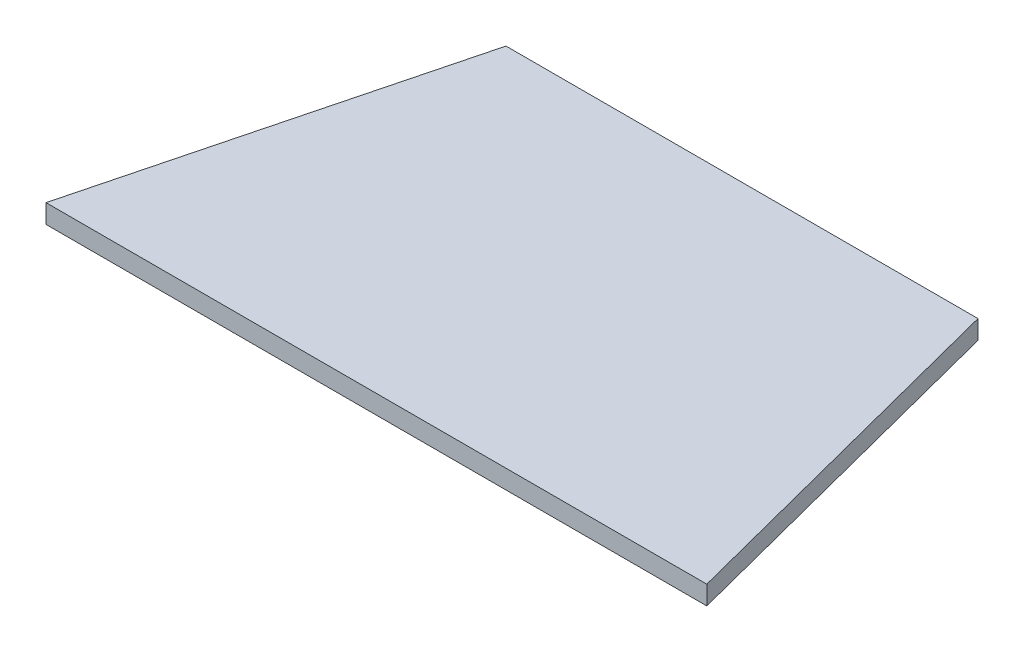
ISO-10303-21;
HEADER;
FILE_DESCRIPTION(('STEP AP214'),'2;1');
FILE_NAME('part.step','',(''),(''),'','','');
FILE_SCHEMA(('AUTOMOTIVE_DESIGN { 1 0 10303 214 1 1 1 1 }'));
ENDSEC;
DATA;
#1=APPLICATION_CONTEXT('core data for automotive mechanical design processes');
#2=APPLICATION_PROTOCOL_DEFINITION('international standard','automotive_design',2000,#1);
#3=PRODUCT_CONTEXT('',#1,'mechanical');
#4=PRODUCT('Part','Part','',(#3));
#5=PRODUCT_RELATED_PRODUCT_CATEGORY('part','',(#4));
#6=PRODUCT_DEFINITION_FORMATION('','',#4);
#7=PRODUCT_DEFINITION_CONTEXT('part definition',#1,'design');
#8=PRODUCT_DEFINITION('design','',#6,#7);
#9=PRODUCT_DEFINITION_SHAPE('','',#8);
#10=(LENGTH_UNIT() NAMED_UNIT(*) SI_UNIT(.MILLI.,.METRE.));
#11=(NAMED_UNIT(*) PLANE_ANGLE_UNIT() SI_UNIT($,.RADIAN.));
#12=(NAMED_UNIT(*) SI_UNIT($,.STERADIAN.) SOLID_ANGLE_UNIT());
#13=UNCERTAINTY_MEASURE_WITH_UNIT(LENGTH_MEASURE(1.E-05),#10,'distance_accuracy_value','');
#14=(GEOMETRIC_REPRESENTATION_CONTEXT(3) GLOBAL_UNCERTAINTY_ASSIGNED_CONTEXT((#13)) GLOBAL_UNIT_ASSIGNED_CONTEXT((#10,
#11,#12)) REPRESENTATION_CONTEXT('',''));
#15=CARTESIAN_POINT('',(0.,0.,0.));
#16=DIRECTION('',(0.,0.,1.));
#17=DIRECTION('',(1.,0.,0.));
#18=AXIS2_PLACEMENT_3D('',#15,#16,#17);
#19=CARTESIAN_POINT('',(125.,10.,-96.8245836551855));
#20=DIRECTION('',(0.,0.,1.));
#21=DIRECTION('',(1.,0.,0.));
#22=AXIS2_PLACEMENT_3D('',#19,#20,#21);
#23=PLANE('',#22);
#24=DIRECTION('',(-1.,0.,0.));
#25=VECTOR('',#24,1.);
#26=CARTESIAN_POINT('',(125.,0.,-96.8245836551855));
#27=LINE('',#26,#25);
#28=CARTESIAN_POINT('',(125.,0.,-96.8245836551855));
#29=VERTEX_POINT('',#28);
#30=CARTESIAN_POINT('',(-125.,0.,-96.8245836551854));
#31=VERTEX_POINT('',#30);
#32=EDGE_CURVE('E124',#29,#31,#27,.T.);
#33=ORIENTED_EDGE('',*,*,#32,.T.);
#34=DIRECTION('',(0.,-1.,0.));
#35=VECTOR('',#34,1.);
#36=CARTESIAN_POINT('',(-125.,10.,-96.8245836551854));
#37=LINE('',#36,#35);
#38=CARTESIAN_POINT('',(-125.,10.,-96.8245836551854));
#39=VERTEX_POINT('',#38);
#40=EDGE_CURVE('E11',#39,#31,#37,.T.);
#41=ORIENTED_EDGE('',*,*,#40,.F.);
#42=DIRECTION('',(-1.,0.,0.));
#43=VECTOR('',#42,1.);
#44=CARTESIAN_POINT('',(125.,10.,-96.8245836551855));
#45=LINE('',#44,#43);
#46=CARTESIAN_POINT('',(125.,10.,-96.8245836551855));
#47=VERTEX_POINT('',#46);
#48=EDGE_CURVE('E107',#47,#39,#45,.T.);
#49=ORIENTED_EDGE('',*,*,#48,.F.);
#50=DIRECTION('',(0.,-1.,0.));
#51=VECTOR('',#50,1.);
#52=CARTESIAN_POINT('',(125.,10.,-96.8245836551855));
#53=LINE('',#52,#51);
#54=EDGE_CURVE('E120',#47,#29,#53,.T.);
#55=ORIENTED_EDGE('',*,*,#54,.T.);
#56=EDGE_LOOP('',(#33,#41,#49,#55));
#57=FACE_BOUND('',#56,.T.);
#58=ADVANCED_FACE('F47',(#57),#23,.F.);
#59=CARTESIAN_POINT('',(-125.,10.,-96.8245836551854));
#60=DIRECTION('',(0.968245836551854,0.,0.25));
#61=DIRECTION('',(0.25,0.,-0.968245836551854));
#62=AXIS2_PLACEMENT_3D('',#59,#60,#61);
#63=PLANE('',#62);
#64=DIRECTION('',(-0.25,0.,0.968245836551854));
#65=VECTOR('',#64,1.);
#66=CARTESIAN_POINT('',(-125.,0.,-96.8245836551854));
#67=LINE('',#66,#65);
#68=CARTESIAN_POINT('',(-175.,0.,96.8245836551854));
#69=VERTEX_POINT('',#68);
#70=EDGE_CURVE('E112',#31,#69,#67,.T.);
#71=ORIENTED_EDGE('',*,*,#70,.T.);
#72=DIRECTION('',(0.,-1.,0.));
#73=VECTOR('',#72,1.);
#74=CARTESIAN_POINT('',(-175.,10.,96.8245836551854));
#75=LINE('',#74,#73);
#76=CARTESIAN_POINT('',(-175.,10.,96.8245836551854));
#77=VERTEX_POINT('',#76);
#78=EDGE_CURVE('E56',#77,#69,#75,.T.);
#79=ORIENTED_EDGE('',*,*,#78,.F.);
#80=DIRECTION('',(-0.25,0.,0.968245836551854));
#81=VECTOR('',#80,1.);
#82=CARTESIAN_POINT('',(-125.,10.,-96.8245836551854));
#83=LINE('',#82,#81);
#84=EDGE_CURVE('E101',#39,#77,#83,.T.);
#85=ORIENTED_EDGE('',*,*,#84,.F.);
#86=ORIENTED_EDGE('',*,*,#40,.T.);
#87=EDGE_LOOP('',(#71,#79,#85,#86));
#88=FACE_BOUND('',#87,.T.);
#89=ADVANCED_FACE('F111',(#88),#63,.F.);
#90=CARTESIAN_POINT('',(-175.,10.,96.8245836551854));
#91=DIRECTION('',(0.,0.,-1.));
#92=DIRECTION('',(-1.,0.,0.));
#93=AXIS2_PLACEMENT_3D('',#90,#91,#92);
#94=PLANE('',#93);
#95=DIRECTION('',(1.,0.,0.));
#96=VECTOR('',#95,1.);
#97=CARTESIAN_POINT('',(-175.,0.,96.8245836551854));
#98=LINE('',#97,#96);
#99=CARTESIAN_POINT('',(175.,0.,96.8245836551854));
#100=VERTEX_POINT('',#99);
#101=EDGE_CURVE('E88',#69,#100,#98,.T.);
#102=ORIENTED_EDGE('',*,*,#101,.T.);
#103=DIRECTION('',(0.,-1.,0.));
#104=VECTOR('',#103,1.);
#105=CARTESIAN_POINT('',(175.,10.,96.8245836551854));
#106=LINE('',#105,#104);
#107=CARTESIAN_POINT('',(175.,10.,96.8245836551854));
#108=VERTEX_POINT('',#107);
#109=EDGE_CURVE('E114',#108,#100,#106,.T.);
#110=ORIENTED_EDGE('',*,*,#109,.F.);
#111=DIRECTION('',(1.,0.,0.));
#112=VECTOR('',#111,1.);
#113=CARTESIAN_POINT('',(-175.,10.,96.8245836551854));
#114=LINE('',#113,#112);
#115=EDGE_CURVE('E105',#77,#108,#114,.T.);
#116=ORIENTED_EDGE('',*,*,#115,.F.);
#117=ORIENTED_EDGE('',*,*,#78,.T.);
#118=EDGE_LOOP('',(#102,#110,#116,#117));
#119=FACE_BOUND('',#118,.T.);
#120=ADVANCED_FACE('F115',(#119),#94,.F.);
#121=CARTESIAN_POINT('',(175.,10.,96.8245836551854));
#122=DIRECTION('',(-0.968245836551854,0.,0.25));
#123=DIRECTION('',(0.25,0.,0.968245836551854));
#124=AXIS2_PLACEMENT_3D('',#121,#122,#123);
#125=PLANE('',#124);
#126=DIRECTION('',(-0.25,0.,-0.968245836551854));
#127=VECTOR('',#126,1.);
#128=CARTESIAN_POINT('',(175.,0.,96.8245836551854));
#129=LINE('',#128,#127);
#130=EDGE_CURVE('E94',#100,#29,#129,.T.);
#131=ORIENTED_EDGE('',*,*,#130,.T.);
#132=ORIENTED_EDGE('',*,*,#54,.F.);
#133=DIRECTION('',(-0.25,0.,-0.968245836551854));
#134=VECTOR('',#133,1.);
#135=CARTESIAN_POINT('',(175.,10.,96.8245836551854));
#136=LINE('',#135,#134);
#137=EDGE_CURVE('E66',#108,#47,#136,.T.);
#138=ORIENTED_EDGE('',*,*,#137,.F.);
#139=ORIENTED_EDGE('',*,*,#109,.T.);
#140=EDGE_LOOP('',(#131,#132,#138,#139));
#141=FACE_BOUND('',#140,.T.);
#142=ADVANCED_FACE('F136',(#141),#125,.F.);
#143=CARTESIAN_POINT('',(0.,10.,0.));
#144=DIRECTION('',(0.,1.,0.));
#145=DIRECTION('',(0.,0.,1.));
#146=AXIS2_PLACEMENT_3D('',#143,#144,#145);
#147=PLANE('',#146);
#148=ORIENTED_EDGE('',*,*,#48,.T.);
#149=ORIENTED_EDGE('',*,*,#84,.T.);
#150=ORIENTED_EDGE('',*,*,#115,.T.);
#151=ORIENTED_EDGE('',*,*,#137,.T.);
#152=EDGE_LOOP('',(#148,#149,#150,#151));
#153=FACE_BOUND('',#152,.T.);
#154=ADVANCED_FACE('F103',(#153),#147,.T.);
#155=CARTESIAN_POINT('',(0.,0.,0.));
#156=DIRECTION('',(0.,1.,0.));
#157=DIRECTION('',(0.,0.,1.));
#158=AXIS2_PLACEMENT_3D('',#155,#156,#157);
#159=PLANE('',#158);
#160=ORIENTED_EDGE('',*,*,#32,.F.);
#161=ORIENTED_EDGE('',*,*,#130,.F.);
#162=ORIENTED_EDGE('',*,*,#101,.F.);
#163=ORIENTED_EDGE('',*,*,#70,.F.);
#164=EDGE_LOOP('',(#160,#161,#162,#163));
#165=FACE_BOUND('',#164,.T.);
#166=ADVANCED_FACE('F139',(#165),#159,.F.);
#167=CLOSED_SHELL('',(#58,#89,#120,#142,#154,#166));
#168=MANIFOLD_SOLID_BREP('B2',#167);
#169=ADVANCED_BREP_SHAPE_REPRESENTATION('',(#18,#168),#14);
#170=SHAPE_DEFINITION_REPRESENTATION(#9,#169);
ENDSEC;
END-ISO-10303-21;
